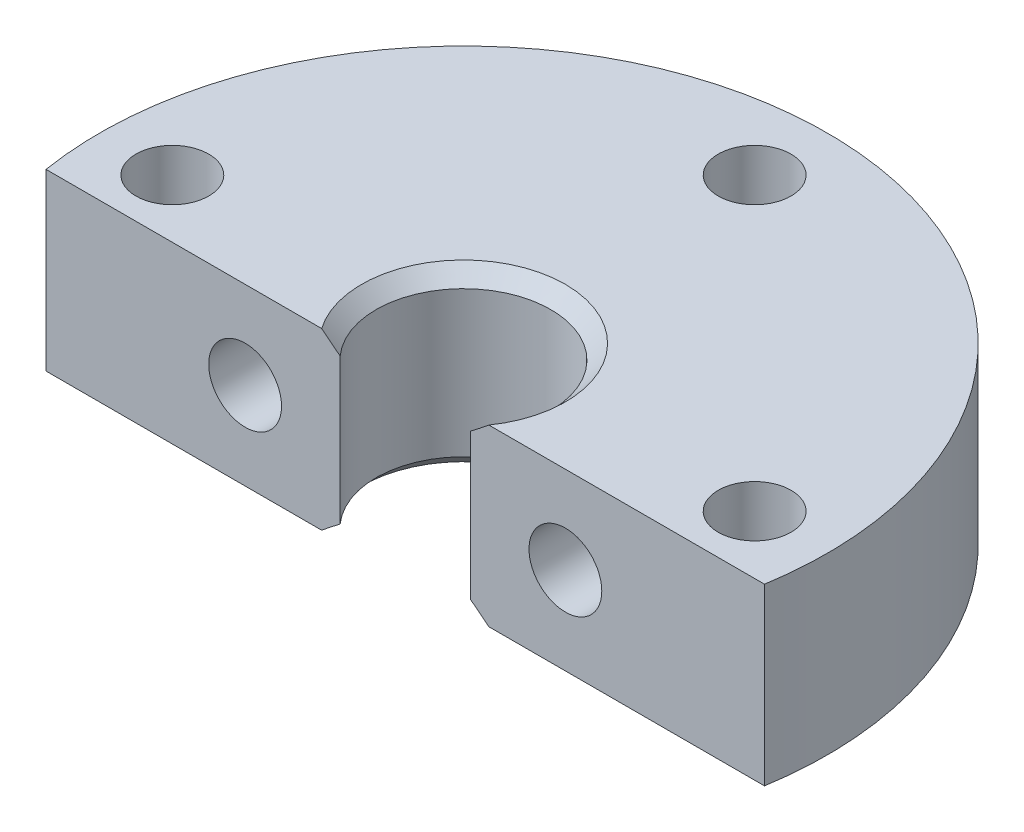
ISO-10303-21;
HEADER;
FILE_DESCRIPTION(('STEP AP214'),'2;1');
FILE_NAME('part.step','',(''),(''),'','','');
FILE_SCHEMA(('AUTOMOTIVE_DESIGN { 1 0 10303 214 1 1 1 1 }'));
ENDSEC;
DATA;
#1=APPLICATION_CONTEXT('core data for automotive mechanical design processes');
#2=APPLICATION_PROTOCOL_DEFINITION('international standard','automotive_design',2000,#1);
#3=PRODUCT_CONTEXT('',#1,'mechanical');
#4=PRODUCT('Part','Part','',(#3));
#5=PRODUCT_RELATED_PRODUCT_CATEGORY('part','',(#4));
#6=PRODUCT_DEFINITION_FORMATION('','',#4);
#7=PRODUCT_DEFINITION_CONTEXT('part definition',#1,'design');
#8=PRODUCT_DEFINITION('design','',#6,#7);
#9=PRODUCT_DEFINITION_SHAPE('','',#8);
#10=(LENGTH_UNIT() NAMED_UNIT(*) SI_UNIT(.MILLI.,.METRE.));
#11=(NAMED_UNIT(*) PLANE_ANGLE_UNIT() SI_UNIT($,.RADIAN.));
#12=(NAMED_UNIT(*) SI_UNIT($,.STERADIAN.) SOLID_ANGLE_UNIT());
#13=UNCERTAINTY_MEASURE_WITH_UNIT(LENGTH_MEASURE(1.E-05),#10,'distance_accuracy_value','');
#14=(GEOMETRIC_REPRESENTATION_CONTEXT(3) GLOBAL_UNCERTAINTY_ASSIGNED_CONTEXT((#13)) GLOBAL_UNIT_ASSIGNED_CONTEXT((#10,
#11,#12)) REPRESENTATION_CONTEXT('',''));
#15=CARTESIAN_POINT('',(0.,0.,0.));
#16=DIRECTION('',(0.,0.,1.));
#17=DIRECTION('',(1.,0.,0.));
#18=AXIS2_PLACEMENT_3D('',#15,#16,#17);
#19=CARTESIAN_POINT('',(-12.3389626792531,47.8260526926028,2.));
#20=DIRECTION('',(0.,0.,-1.));
#21=DIRECTION('',(-1.,0.,0.));
#22=AXIS2_PLACEMENT_3D('',#19,#20,#21);
#23=PLANE('',#22);
#24=CARTESIAN_POINT('',(5.5,0.,2.));
#25=DIRECTION('',(0.,0.,1.));
#26=DIRECTION('',(1.,0.,0.));
#27=AXIS2_PLACEMENT_3D('',#24,#25,#26);
#28=CIRCLE('',#27,1.25);
#29=CARTESIAN_POINT('',(6.75,0.,2.));
#30=VERTEX_POINT('',#29);
#31=EDGE_CURVE('E124',#30,#30,#28,.T.);
#32=ORIENTED_EDGE('',*,*,#31,.F.);
#33=EDGE_LOOP('',(#32));
#34=FACE_BOUND('',#33,.T.);
#35=DIRECTION('',(0.,-1.,0.));
#36=VECTOR('',#35,1.);
#37=CARTESIAN_POINT('',(2.23606797749979,3.,2.));
#38=LINE('',#37,#36);
#39=CARTESIAN_POINT('',(2.23606797749979,2.5,2.));
#40=VERTEX_POINT('',#39);
#41=CARTESIAN_POINT('',(2.23606797749979,-2.5,2.));
#42=VERTEX_POINT('',#41);
#43=EDGE_CURVE('E150',#40,#42,#38,.T.);
#44=ORIENTED_EDGE('',*,*,#43,.T.);
#45=CARTESIAN_POINT('',(2.23606797749979,-2.5,2.));
#46=CARTESIAN_POINT('',(2.29014100075972,-2.54030914708773,2.));
#47=CARTESIAN_POINT('',(2.34390647751658,-2.58102771859284,2.));
#48=CARTESIAN_POINT('',(2.45088416810582,-2.66317097450976,2.));
#49=CARTESIAN_POINT('',(2.50409645531304,-2.70459556330116,2.));
#50=CARTESIAN_POINT('',(2.61004249408468,-2.78804774999364,2.));
#51=CARTESIAN_POINT('',(2.66277626003621,-2.83007532966664,2.));
#52=CARTESIAN_POINT('',(2.76782848015724,-2.9146609758981,2.));
#53=CARTESIAN_POINT('',(2.82014687764002,-2.95721911289362,2.));
#54=CARTESIAN_POINT('',(2.87228132326901,-3.,2.));
#55=B_SPLINE_CURVE_WITH_KNOTS('',3,(#45,#46,#47,#48,#49,#50,#51,#52,#53,#54),.UNSPECIFIED.,.F.,
.F.,(4,2,2,2,4),(0.,0.202327942602672,0.404628697035497,0.606923348858633,0.809245149648635),.UNSPECIFIED.);
#56=CARTESIAN_POINT('',(2.87228132326901,-3.,2.));
#57=VERTEX_POINT('',#56);
#58=EDGE_CURVE('E49',#42,#57,#55,.T.);
#59=ORIENTED_EDGE('',*,*,#58,.T.);
#60=DIRECTION('',(-1.,0.,0.));
#61=VECTOR('',#60,1.);
#62=CARTESIAN_POINT('',(0.,-3.,2.));
#63=LINE('',#62,#61);
#64=CARTESIAN_POINT('',(12.3389626792531,-3.,2.));
#65=VERTEX_POINT('',#64);
#66=EDGE_CURVE('E102',#65,#57,#63,.T.);
#67=ORIENTED_EDGE('',*,*,#66,.F.);
#68=DIRECTION('',(0.,-1.,0.));
#69=VECTOR('',#68,1.);
#70=CARTESIAN_POINT('',(12.3389626792531,47.8260526926028,2.));
#71=LINE('',#70,#69);
#72=CARTESIAN_POINT('',(12.3389626792531,3.,2.));
#73=VERTEX_POINT('',#72);
#74=EDGE_CURVE('E109',#73,#65,#71,.T.);
#75=ORIENTED_EDGE('',*,*,#74,.F.);
#76=DIRECTION('',(-1.,0.,0.));
#77=VECTOR('',#76,1.);
#78=CARTESIAN_POINT('',(0.,3.,2.));
#79=LINE('',#78,#77);
#80=CARTESIAN_POINT('',(2.87228132326901,3.,2.));
#81=VERTEX_POINT('',#80);
#82=EDGE_CURVE('E93',#73,#81,#79,.T.);
#83=ORIENTED_EDGE('',*,*,#82,.T.);
#84=CARTESIAN_POINT('',(2.87228132326901,3.,2.));
#85=CARTESIAN_POINT('',(2.82014687764002,2.95721911289362,2.));
#86=CARTESIAN_POINT('',(2.76782848015724,2.9146609758981,2.));
#87=CARTESIAN_POINT('',(2.66277626003621,2.83007532966664,2.));
#88=CARTESIAN_POINT('',(2.61004249408468,2.78804774999364,2.));
#89=CARTESIAN_POINT('',(2.50409645531304,2.70459556330116,2.));
#90=CARTESIAN_POINT('',(2.45088416810582,2.66317097450976,2.));
#91=CARTESIAN_POINT('',(2.34390647751658,2.58102771859284,2.));
#92=CARTESIAN_POINT('',(2.29014100075972,2.54030914708773,2.));
#93=CARTESIAN_POINT('',(2.23606797749979,2.5,2.));
#94=B_SPLINE_CURVE_WITH_KNOTS('',3,(#84,#85,#86,#87,#88,#89,#90,#91,#92,#93),.UNSPECIFIED.,.F.,
.F.,(4,2,2,2,4),(0.,0.202321800790002,0.404616452613138,0.606917207045964,0.809245149648636),.UNSPECIFIED.);
#95=EDGE_CURVE('E199',#81,#40,#94,.T.);
#96=ORIENTED_EDGE('',*,*,#95,.T.);
#97=EDGE_LOOP('',(#44,#59,#67,#75,#83,#96));
#98=FACE_BOUND('',#97,.T.);
#99=ADVANCED_FACE('F40',(#34,#98),#23,.F.);
#100=CARTESIAN_POINT('',(0.,3.,0.));
#101=DIRECTION('',(0.,1.,0.));
#102=DIRECTION('',(0.,0.,1.));
#103=AXIS2_PLACEMENT_3D('',#100,#101,#102);
#104=PLANE('',#103);
#105=CARTESIAN_POINT('',(-2.87228132326901,3.,2.));
#106=VERTEX_POINT('',#105);
#107=CARTESIAN_POINT('',(-12.3389626792531,3.,2.));
#108=VERTEX_POINT('',#107);
#109=EDGE_CURVE('E104',#106,#108,#79,.T.);
#110=ORIENTED_EDGE('',*,*,#109,.F.);
#111=CARTESIAN_POINT('',(0.,3.,0.));
#112=DIRECTION('',(0.,1.,0.));
#113=DIRECTION('',(0.,0.,1.));
#114=AXIS2_PLACEMENT_3D('',#111,#112,#113);
#115=CIRCLE('',#114,3.5);
#116=EDGE_CURVE('E11',#106,#81,#115,.F.);
#117=ORIENTED_EDGE('',*,*,#116,.T.);
#118=ORIENTED_EDGE('',*,*,#82,.F.);
#119=CARTESIAN_POINT('',(0.,3.,0.));
#120=DIRECTION('',(0.,1.,0.));
#121=DIRECTION('',(0.,0.,1.));
#122=AXIS2_PLACEMENT_3D('',#119,#120,#121);
#123=CIRCLE('',#122,12.5);
#124=EDGE_CURVE('E97',#73,#108,#123,.T.);
#125=ORIENTED_EDGE('',*,*,#124,.T.);
#126=EDGE_LOOP('',(#110,#117,#118,#125));
#127=FACE_BOUND('',#126,.T.);
#128=CARTESIAN_POINT('',(0.,3.,-10.));
#129=DIRECTION('',(0.,1.,0.));
#130=DIRECTION('',(0.,0.,1.));
#131=AXIS2_PLACEMENT_3D('',#128,#129,#130);
#132=CIRCLE('',#131,1.25);
#133=CARTESIAN_POINT('',(0.,3.,-8.75));
#134=VERTEX_POINT('',#133);
#135=EDGE_CURVE('E101',#134,#134,#132,.T.);
#136=ORIENTED_EDGE('',*,*,#135,.F.);
#137=EDGE_LOOP('',(#136));
#138=FACE_BOUND('',#137,.T.);
#139=CARTESIAN_POINT('',(10.,3.,0.));
#140=DIRECTION('',(0.,1.,0.));
#141=DIRECTION('',(0.,0.,1.));
#142=AXIS2_PLACEMENT_3D('',#139,#140,#141);
#143=CIRCLE('',#142,1.25);
#144=CARTESIAN_POINT('',(10.,3.,1.25));
#145=VERTEX_POINT('',#144);
#146=EDGE_CURVE('E133',#145,#145,#143,.T.);
#147=ORIENTED_EDGE('',*,*,#146,.F.);
#148=EDGE_LOOP('',(#147));
#149=FACE_BOUND('',#148,.T.);
#150=CARTESIAN_POINT('',(-10.,3.,0.));
#151=DIRECTION('',(0.,1.,0.));
#152=DIRECTION('',(0.,0.,1.));
#153=AXIS2_PLACEMENT_3D('',#150,#151,#152);
#154=CIRCLE('',#153,1.25);
#155=CARTESIAN_POINT('',(-10.,3.,1.25));
#156=VERTEX_POINT('',#155);
#157=EDGE_CURVE('E139',#156,#156,#154,.T.);
#158=ORIENTED_EDGE('',*,*,#157,.F.);
#159=EDGE_LOOP('',(#158));
#160=FACE_BOUND('',#159,.T.);
#161=ADVANCED_FACE('F95',(#127,#138,#149,#160),#104,.T.);
#162=CARTESIAN_POINT('',(0.,-3.,0.));
#163=DIRECTION('',(0.,1.,0.));
#164=DIRECTION('',(0.,0.,1.));
#165=AXIS2_PLACEMENT_3D('',#162,#163,#164);
#166=PLANE('',#165);
#167=CARTESIAN_POINT('',(0.,-3.,-10.));
#168=DIRECTION('',(0.,1.,0.));
#169=DIRECTION('',(0.,0.,1.));
#170=AXIS2_PLACEMENT_3D('',#167,#168,#169);
#171=CIRCLE('',#170,1.25);
#172=CARTESIAN_POINT('',(0.,-3.,-8.75));
#173=VERTEX_POINT('',#172);
#174=EDGE_CURVE('E130',#173,#173,#171,.T.);
#175=ORIENTED_EDGE('',*,*,#174,.T.);
#176=EDGE_LOOP('',(#175));
#177=FACE_BOUND('',#176,.T.);
#178=CARTESIAN_POINT('',(10.,-3.,0.));
#179=DIRECTION('',(0.,1.,0.));
#180=DIRECTION('',(0.,0.,1.));
#181=AXIS2_PLACEMENT_3D('',#178,#179,#180);
#182=CIRCLE('',#181,1.25);
#183=CARTESIAN_POINT('',(10.,-3.,1.25));
#184=VERTEX_POINT('',#183);
#185=EDGE_CURVE('E136',#184,#184,#182,.T.);
#186=ORIENTED_EDGE('',*,*,#185,.T.);
#187=EDGE_LOOP('',(#186));
#188=FACE_BOUND('',#187,.T.);
#189=CARTESIAN_POINT('',(-10.,-3.,0.));
#190=DIRECTION('',(0.,1.,0.));
#191=DIRECTION('',(0.,0.,1.));
#192=AXIS2_PLACEMENT_3D('',#189,#190,#191);
#193=CIRCLE('',#192,1.25);
#194=CARTESIAN_POINT('',(-10.,-3.,1.25));
#195=VERTEX_POINT('',#194);
#196=EDGE_CURVE('E142',#195,#195,#193,.T.);
#197=ORIENTED_EDGE('',*,*,#196,.T.);
#198=EDGE_LOOP('',(#197));
#199=FACE_BOUND('',#198,.T.);
#200=ORIENTED_EDGE('',*,*,#66,.T.);
#201=CARTESIAN_POINT('',(0.,-3.,0.));
#202=DIRECTION('',(0.,1.,0.));
#203=DIRECTION('',(0.,0.,1.));
#204=AXIS2_PLACEMENT_3D('',#201,#202,#203);
#205=CIRCLE('',#204,3.5);
#206=CARTESIAN_POINT('',(-2.87228132326901,-3.,2.));
#207=VERTEX_POINT('',#206);
#208=EDGE_CURVE('E152',#57,#207,#205,.T.);
#209=ORIENTED_EDGE('',*,*,#208,.T.);
#210=CARTESIAN_POINT('',(-12.3389626792531,-3.,2.));
#211=VERTEX_POINT('',#210);
#212=EDGE_CURVE('E118',#207,#211,#63,.T.);
#213=ORIENTED_EDGE('',*,*,#212,.T.);
#214=CARTESIAN_POINT('',(0.,-3.,0.));
#215=DIRECTION('',(0.,1.,0.));
#216=DIRECTION('',(0.,0.,1.));
#217=AXIS2_PLACEMENT_3D('',#214,#215,#216);
#218=CIRCLE('',#217,12.5);
#219=EDGE_CURVE('E114',#65,#211,#218,.T.);
#220=ORIENTED_EDGE('',*,*,#219,.F.);
#221=EDGE_LOOP('',(#200,#209,#213,#220));
#222=FACE_BOUND('',#221,.T.);
#223=ADVANCED_FACE('F226',(#177,#188,#199,#222),#166,.F.);
#224=CARTESIAN_POINT('',(0.,3.,0.));
#225=DIRECTION('',(0.,-1.,0.));
#226=DIRECTION('',(0.,0.,-1.));
#227=AXIS2_PLACEMENT_3D('',#224,#225,#226);
#228=CYLINDRICAL_SURFACE('',#227,12.5);
#229=CARTESIAN_POINT('',(-4.25,0.,-11.7553179455087));
#230=CARTESIAN_POINT('',(-4.25000345674519,0.0668613484608272,-11.7553172332848));
#231=CARTESIAN_POINT('',(-4.25538818627799,0.133776691509218,-11.7533742342802));
#232=CARTESIAN_POINT('',(-4.27673836774484,0.26572384369361,-11.7456218404402));
#233=CARTESIAN_POINT('',(-4.29271765494207,0.330753073731363,-11.7398073898961));
#234=CARTESIAN_POINT('',(-4.33461832346783,0.456943222824921,-11.7244009693629));
#235=CARTESIAN_POINT('',(-4.3605251592069,0.518109649551407,-11.7148145254535));
#236=CARTESIAN_POINT('',(-4.42130977785059,0.63503550734847,-11.692008734906));
#237=CARTESIAN_POINT('',(-4.45618564412297,0.690796090116854,-11.6787901643919));
#238=CARTESIAN_POINT('',(-4.53445042013958,0.796637347034647,-11.6486285442597));
#239=CARTESIAN_POINT('',(-4.5779942689212,0.846583639425174,-11.6316169081463));
#240=CARTESIAN_POINT('',(-4.67165471340862,0.938429334319294,-11.5943167374045));
#241=CARTESIAN_POINT('',(-4.72177280392449,0.980326901398347,-11.5740274572823));
#242=CARTESIAN_POINT('',(-4.82996797685817,1.0574557490607,-11.5293112055411));
#243=CARTESIAN_POINT('',(-4.8883330047006,1.09218515538404,-11.5047166165608));
#244=CARTESIAN_POINT('',(-5.00887144465323,1.15143735665078,-11.4527515384886));
#245=CARTESIAN_POINT('',(-5.07104607487446,1.17595686726184,-11.4253801596714));
#246=CARTESIAN_POINT('',(-5.2025011216038,1.21617461271224,-11.3661589798297));
#247=CARTESIAN_POINT('',(-5.27195652117598,1.23103078625171,-11.3341263138329));
#248=CARTESIAN_POINT('',(-5.41148949146377,1.24884694809605,-11.2681740403745));
#249=CARTESIAN_POINT('',(-5.48156729192876,1.25180234351852,-11.234253709523));
#250=CARTESIAN_POINT('',(-5.62645436866693,1.24586942784723,-11.1624401249244));
#251=CARTESIAN_POINT('',(-5.70117565521891,1.23598142875191,-11.124450301522));
#252=CARTESIAN_POINT('',(-5.84754885476173,1.20305555664296,-11.0482121953589));
#253=CARTESIAN_POINT('',(-5.91919946654668,1.18001216709149,-11.0099638108272));
#254=CARTESIAN_POINT('',(-6.06095084580953,1.11983959010204,-10.9325978464201));
#255=CARTESIAN_POINT('',(-6.13081592153604,1.08209273203985,-10.8935254141596));
#256=CARTESIAN_POINT('',(-6.26313564257604,0.993214242157514,-10.817991452027));
#257=CARTESIAN_POINT('',(-6.3255889532468,0.94208020499559,-10.7815303928542));
#258=CARTESIAN_POINT('',(-6.43835838749237,0.829501172039707,-10.7145542519981));
#259=CARTESIAN_POINT('',(-6.48906318598494,0.768556740657068,-10.6838583504358));
#260=CARTESIAN_POINT('',(-6.57894417327889,0.636201467528272,-10.6287478634939));
#261=CARTESIAN_POINT('',(-6.61813649572527,0.564805485067386,-10.6043244938501));
#262=CARTESIAN_POINT('',(-6.67788325146892,0.424348376796737,-10.5667851637489));
#263=CARTESIAN_POINT('',(-6.70028406723274,0.356371897579531,-10.5525618049955));
#264=CARTESIAN_POINT('',(-6.73319100802673,0.216514747344688,-10.5315968779079));
#265=CARTESIAN_POINT('',(-6.74371304062787,0.144639433078595,-10.5248453039109));
#266=CARTESIAN_POINT('',(-6.75148794351955,0.0105447371655662,-10.519858393158));
#267=CARTESIAN_POINT('',(-6.75046408213084,-0.051540831638064,-10.520517018036));
#268=CARTESIAN_POINT('',(-6.73929301123134,-0.174533530603388,-10.5276765765414));
#269=CARTESIAN_POINT('',(-6.72914729130722,-0.23544085151251,-10.5341765562837));
#270=CARTESIAN_POINT('',(-6.70080929528355,-0.352194547865052,-10.5522234900481));
#271=CARTESIAN_POINT('',(-6.682915891399,-0.408143864675181,-10.5635828126127));
#272=CARTESIAN_POINT('',(-6.63996846894322,-0.516090007051906,-10.5906307705649));
#273=CARTESIAN_POINT('',(-6.61491279209622,-0.568085913754807,-10.6063204085182));
#274=CARTESIAN_POINT('',(-6.5561399045948,-0.671492267431835,-10.6427590574689));
#275=CARTESIAN_POINT('',(-6.52186508134485,-0.722472089378917,-10.6638260662586));
#276=CARTESIAN_POINT('',(-6.44710886278282,-0.818028352743835,-10.7091876388131));
#277=CARTESIAN_POINT('',(-6.40662433668151,-0.862601542003174,-10.7334838298277));
#278=CARTESIAN_POINT('',(-6.31428945362473,-0.950828636926263,-10.7880960900921));
#279=CARTESIAN_POINT('',(-6.26164194906051,-0.993423834649065,-10.8187750690453));
#280=CARTESIAN_POINT('',(-6.15100455994088,-1.06920309393133,-10.8820591695239));
#281=CARTESIAN_POINT('',(-6.09301168989054,-1.1023818535056,-10.9146653637464));
#282=CARTESIAN_POINT('',(-5.96516624916379,-1.16264185292153,-10.9851159205881));
#283=CARTESIAN_POINT('',(-5.89474989167102,-1.18837942710726,-11.0230923306814));
#284=CARTESIAN_POINT('',(-5.75044744567118,-1.22693015939865,-11.0990544679328));
#285=CARTESIAN_POINT('',(-5.67655995715346,-1.23973805492108,-11.1370401925953));
#286=CARTESIAN_POINT('',(-5.52319022924411,-1.25227218607796,-11.2139243038092));
#287=CARTESIAN_POINT('',(-5.44361811781652,-1.25127500325224,-11.2527656231855));
#288=CARTESIAN_POINT('',(-5.28501414662015,-1.2339532667149,-11.3281212003068));
#289=CARTESIAN_POINT('',(-5.20598222038514,-1.21763063418609,-11.3646357491206));
#290=CARTESIAN_POINT('',(-5.05408897020462,-1.17036321388702,-11.4329726521292));
#291=CARTESIAN_POINT('',(-4.98110740177532,-1.13998878634082,-11.4649195009553));
#292=CARTESIAN_POINT('',(-4.84096127845225,-1.06511389142923,-11.5247948698215));
#293=CARTESIAN_POINT('',(-4.77379316144207,-1.02062215337791,-11.552725857566));
#294=CARTESIAN_POINT('',(-4.65365360677432,-0.922860358787281,-11.6016102066832));
#295=CARTESIAN_POINT('',(-4.59995740609171,-0.870678202681455,-11.6229575808767));
#296=CARTESIAN_POINT('',(-4.5021359084911,-0.756574149688452,-11.6611979179524));
#297=CARTESIAN_POINT('',(-4.45800815618737,-0.694654758552783,-11.6780920238406));
#298=CARTESIAN_POINT('',(-4.38450050860092,-0.568384593618249,-11.7058779211666));
#299=CARTESIAN_POINT('',(-4.35421118447654,-0.504644233923224,-11.7171469383675));
#300=CARTESIAN_POINT('',(-4.30471574667119,-0.372497111755937,-11.7354218857582));
#301=CARTESIAN_POINT('',(-4.28549011270039,-0.304098807573135,-11.7424353254996));
#302=CARTESIAN_POINT('',(-4.26482190134429,-0.195917784570939,-11.7499510057766));
#303=CARTESIAN_POINT('',(-4.25927241700521,-0.156975478670739,-11.7519621356184));
#304=CARTESIAN_POINT('',(-4.25186048738663,-0.0786950125277672,-11.7546458011511));
#305=CARTESIAN_POINT('',(-4.24999796524238,-0.0393568605546693,-11.7553183647479));
#306=CARTESIAN_POINT('',(-4.25,0.,-11.7553179455087));
#307=B_SPLINE_CURVE_WITH_KNOTS('',3,(#229,#230,#231,#232,#233,#234,#235,#236,#237,#238,#239,
#240,#241,#242,#243,#244,#245,#246,#247,#248,#249,#250,#251,#252,#253,#254,#255,#256,#257,#258,
#259,#260,#261,#262,#263,#264,#265,#266,#267,#268,#269,#270,#271,#272,#273,#274,#275,#276,#277,
#278,#279,#280,#281,#282,#283,#284,#285,#286,#287,#288,#289,#290,#291,#292,#293,#294,#295,#296,
#297,#298,#299,#300,#301,#302,#303,#304,#305,#306),.UNSPECIFIED.,.T.,.F.,(4,2,2,2,2,2,2,2,2,2,2,
2,2,2,2,2,2,2,2,2,2,2,2,2,2,2,2,2,2,2,2,2,2,2,2,2,2,2,4),(0.,0.200435989372092,0.40113424179102,
0.601539553713002,0.801902075661829,1.00623327892485,1.2106110225353,1.42638297912781,
1.64222429199842,1.87498351871439,2.10783256588961,2.35993824184654,2.61214971269543,
2.87635367138669,3.14060513354949,3.39417090739185,3.64737961868948,3.86496512912095,
4.08225891118552,4.26760896841413,4.4529287637354,4.63166054692787,4.81043374532221,
5.00450082445675,5.19866607132667,5.42082019613846,5.64309915919669,5.89412723574543,
6.14525744353823,6.40959512966,6.67389968310146,6.92830823329511,7.18255977777084,
7.41488531548009,7.64715116475751,7.86046932187923,8.07340994666121,8.1913958372916,
8.30937926815938),.UNSPECIFIED.);
#308=CARTESIAN_POINT('',(-4.25,0.,-11.7553179455087));
#309=VERTEX_POINT('',#308);
#310=EDGE_CURVE('E160',#309,#309,#307,.T.);
#311=ORIENTED_EDGE('',*,*,#310,.T.);
#312=EDGE_LOOP('',(#311));
#313=FACE_BOUND('',#312,.T.);
#314=CARTESIAN_POINT('',(6.75,0.,-10.5208127062504));
#315=CARTESIAN_POINT('',(6.7499968001028,0.0626191669154326,-10.520815204356));
#316=CARTESIAN_POINT('',(6.74526699382063,0.125268368654247,-10.5238539532273));
#317=CARTESIAN_POINT('',(6.72661536496011,0.248626826666854,-10.5357848304883));
#318=CARTESIAN_POINT('',(6.71268586771002,0.309334418818792,-10.5446818460097));
#319=CARTESIAN_POINT('',(6.6764603656625,0.426858711286303,-10.5676549073736));
#320=CARTESIAN_POINT('',(6.65419807430464,0.483690013702837,-10.5817100795472));
#321=CARTESIAN_POINT('',(6.60230333438331,0.592507641911917,-10.6141661797684));
#322=CARTESIAN_POINT('',(6.57266964999439,0.644493153289024,-10.6325678364849));
#323=CARTESIAN_POINT('',(6.50484786967596,0.746167579025732,-10.6742043685657));
#324=CARTESIAN_POINT('',(6.46621381461773,0.795457273612462,-10.6976834753877));
#325=CARTESIAN_POINT('',(6.38295663143775,0.886972120240242,-10.7475681866877));
#326=CARTESIAN_POINT('',(6.33833090558829,0.929194190127341,-10.7739750596476));
#327=CARTESIAN_POINT('',(6.23710641180984,1.01196007461214,-10.8329321802554));
#328=CARTESIAN_POINT('',(6.17971565084942,1.05130332878901,-10.8658099249478));
#329=CARTESIAN_POINT('',(6.05990996577121,1.11971678550472,-10.9330791470633));
#330=CARTESIAN_POINT('',(5.99749210145299,1.14878092173835,-10.9674715049303));
#331=CARTESIAN_POINT('',(5.86161762826284,1.19898211234737,-11.0407447647739));
#332=CARTESIAN_POINT('',(5.78771541492501,1.21883039721264,-11.0796886939314));
#333=CARTESIAN_POINT('',(5.63722515586259,1.24479001037631,-11.1570091939385));
#334=CARTESIAN_POINT('',(5.56063632996763,1.2508973143009,-11.1953855953058));
#335=CARTESIAN_POINT('',(5.40458299121282,1.24886167849445,-11.2715672650098));
#336=CARTESIAN_POINT('',(5.32509915411938,1.24030355432007,-11.3093243086821));
#337=CARTESIAN_POINT('',(5.16797823873401,1.2077629224144,-11.3819807844669));
#338=CARTESIAN_POINT('',(5.09034066289362,1.18378462024997,-11.4168809928035));
#339=CARTESIAN_POINT('',(4.94395456679387,1.1221716542803,-11.4809996601218));
#340=CARTESIAN_POINT('',(4.8749520347649,1.08535913205567,-11.5104248730619));
#341=CARTESIAN_POINT('',(4.74393142005977,0.998511569761708,-11.5650400429411));
#342=CARTESIAN_POINT('',(4.681909109841,0.948484595098716,-11.5902325679974));
#343=CARTESIAN_POINT('',(4.57277115590305,0.841462136406786,-11.6336973411895));
#344=CARTESIAN_POINT('',(4.52481865649466,0.785489072076126,-11.6523868538145));
#345=CARTESIAN_POINT('',(4.43905775347717,0.66509726948904,-11.6853276811793));
#346=CARTESIAN_POINT('',(4.40124426990987,0.600682784819063,-11.6995812190559));
#347=CARTESIAN_POINT('',(4.33989341344855,0.470565247014682,-11.7224707343232));
#348=CARTESIAN_POINT('',(4.31549196088883,0.405328952720885,-11.7314503087478));
#349=CARTESIAN_POINT('',(4.27781494676186,0.27130119871156,-11.7452418859145));
#350=CARTESIAN_POINT('',(4.26453611127883,0.202510791474671,-11.7500551150243));
#351=CARTESIAN_POINT('',(4.24998045090966,0.0665262623669337,-11.7553274154351));
#352=CARTESIAN_POINT('',(4.24821041990868,-0.000608639409579366,-11.7559654225758));
#353=CARTESIAN_POINT('',(4.2554277839696,-0.134216370153728,-11.7533547996119));
#354=CARTESIAN_POINT('',(4.2644139516124,-0.200689273791046,-11.7501066129715));
#355=CARTESIAN_POINT('',(4.29263324922586,-0.330330638496287,-11.7398261948057));
#356=CARTESIAN_POINT('',(4.31175130168296,-0.393527628814085,-11.7328364509366));
#357=CARTESIAN_POINT('',(4.3594463443881,-0.515691594687616,-11.7151982511693));
#358=CARTESIAN_POINT('',(4.38802363988157,-0.574658433663585,-11.7045496772019));
#359=CARTESIAN_POINT('',(4.45420097811662,-0.687881369815717,-11.6795274696106));
#360=CARTESIAN_POINT('',(4.49195338745919,-0.742034237609723,-11.6650905626921));
#361=CARTESIAN_POINT('',(4.57487415779576,-0.843161100850198,-11.6328200360742));
#362=CARTESIAN_POINT('',(4.62004372197025,-0.890133929189103,-11.6149858652094));
#363=CARTESIAN_POINT('',(4.71856578042927,-0.977964148668402,-11.5753219745623));
#364=CARTESIAN_POINT('',(4.77219983033623,-1.01843896498002,-11.5533457755852));
#365=CARTESIAN_POINT('',(4.88427588207588,-1.08986426062365,-11.5064130439992));
#366=CARTESIAN_POINT('',(4.94271924070765,-1.12081204043905,-11.48145566944));
#367=CARTESIAN_POINT('',(5.06707765920846,-1.1747314048392,-11.4271450525008));
#368=CARTESIAN_POINT('',(5.13322793269748,-1.19697122874542,-11.3976048790533));
#369=CARTESIAN_POINT('',(5.26729590744731,-1.23009043873566,-11.336270810233));
#370=CARTESIAN_POINT('',(5.33521426168549,-1.24096556487703,-11.3044760745255));
#371=CARTESIAN_POINT('',(5.47691223664934,-1.25197176888655,-11.236552292166));
#372=CARTESIAN_POINT('',(5.5507020463319,-1.25111702340364,-11.2002840434045));
#373=CARTESIAN_POINT('',(5.69654848265614,-1.23662636766816,-11.1268150862597));
#374=CARTESIAN_POINT('',(5.76860444031406,-1.22298560270392,-11.089614028921));
#375=CARTESIAN_POINT('',(5.9138980726085,-1.18205349634425,-11.0128555442252));
#376=CARTESIAN_POINT('',(5.98690508925535,-1.15392811469178,-10.9733030482632));
#377=CARTESIAN_POINT('',(6.12708409433064,-1.08415769709351,-10.8956536270878));
#378=CARTESIAN_POINT('',(6.19425291334694,-1.0425053751041,-10.8575574987088));
#379=CARTESIAN_POINT('',(6.32031860853144,-0.946482612382575,-10.784658185375));
#380=CARTESIAN_POINT('',(6.37925189154594,-0.892171175128503,-10.7498407446564));
#381=CARTESIAN_POINT('',(6.4867492179722,-0.771571573525367,-10.6853176509304));
#382=CARTESIAN_POINT('',(6.53532983831292,-0.705302874525516,-10.6556038408995));
#383=CARTESIAN_POINT('',(6.6085730422657,-0.580827337893174,-10.6102836760174));
#384=CARTESIAN_POINT('',(6.63617320482647,-0.524941351976154,-10.5930149892551));
#385=CARTESIAN_POINT('',(6.68300378353107,-0.408556450760421,-10.5635330366104));
#386=CARTESIAN_POINT('',(6.70224810865321,-0.348065399828862,-10.5513113712182));
#387=CARTESIAN_POINT('',(6.72776302586508,-0.239553337580955,-10.5350543860717));
#388=CARTESIAN_POINT('',(6.73607397723932,-0.192193897911722,-10.5297365220397));
#389=CARTESIAN_POINT('',(6.74719399929748,-0.0965623256688412,-10.5226145265643));
#390=CARTESIAN_POINT('',(6.75000246766834,-0.0482900937629345,-10.5208107797835));
#391=CARTESIAN_POINT('',(6.75,0.,-10.5208127062504));
#392=B_SPLINE_CURVE_WITH_KNOTS('',3,(#314,#315,#316,#317,#318,#319,#320,#321,#322,#323,#324,
#325,#326,#327,#328,#329,#330,#331,#332,#333,#334,#335,#336,#337,#338,#339,#340,#341,#342,#343,
#344,#345,#346,#347,#348,#349,#350,#351,#352,#353,#354,#355,#356,#357,#358,#359,#360,#361,#362,
#363,#364,#365,#366,#367,#368,#369,#370,#371,#372,#373,#374,#375,#376,#377,#378,#379,#380,#381,
#382,#383,#384,#385,#386,#387,#388,#389,#390,#391),.UNSPECIFIED.,.T.,.F.,(4,2,2,2,2,2,2,2,2,2,2,
2,2,2,2,2,2,2,2,2,2,2,2,2,2,2,2,2,2,2,2,2,2,2,2,2,2,2,4),(0.,0.187665644048491,
0.375488042770244,0.562558608291585,0.749660557645252,0.949538693120119,1.14950376858431,
1.37944722986185,1.60952616858822,1.86595041658418,2.1224497547631,2.38633121103219,
2.65014072904413,2.89946489413336,3.14863723509005,3.37553981104399,3.60232848850483,
3.811947462819,4.02150471458463,4.22201873085123,4.42250986809921,4.62077115789498,
4.81903884611528,5.02085591944774,5.22270576311891,5.4338768402987,5.64510769852699,
5.87149688102572,6.09797089282688,6.34358736123602,6.58929712532273,6.8510687771749,
7.11298166213558,7.37369736985373,7.6339924233629,7.82723402609945,8.02015271748711,
8.16485920544571,8.3095815323879),.UNSPECIFIED.);
#393=CARTESIAN_POINT('',(6.75,0.,-10.5208127062504));
#394=VERTEX_POINT('',#393);
#395=EDGE_CURVE('E121',#394,#394,#392,.T.);
#396=ORIENTED_EDGE('',*,*,#395,.T.);
#397=EDGE_LOOP('',(#396));
#398=FACE_BOUND('',#397,.T.);
#399=ORIENTED_EDGE('',*,*,#124,.F.);
#400=ORIENTED_EDGE('',*,*,#74,.T.);
#401=ORIENTED_EDGE('',*,*,#219,.T.);
#402=DIRECTION('',(0.,-1.,0.));
#403=VECTOR('',#402,1.);
#404=CARTESIAN_POINT('',(-12.3389626792531,47.8260526926028,2.));
#405=LINE('',#404,#403);
#406=EDGE_CURVE('E112',#108,#211,#405,.T.);
#407=ORIENTED_EDGE('',*,*,#406,.F.);
#408=EDGE_LOOP('',(#399,#400,#401,#407));
#409=FACE_BOUND('',#408,.T.);
#410=ADVANCED_FACE('F107',(#313,#398,#409),#228,.T.);
#411=CARTESIAN_POINT('',(0.,3.,0.));
#412=DIRECTION('',(0.,-1.,0.));
#413=DIRECTION('',(0.,0.,-1.));
#414=AXIS2_PLACEMENT_3D('',#411,#412,#413);
#415=CYLINDRICAL_SURFACE('',#414,3.);
#416=DIRECTION('',(0.,-1.,0.));
#417=VECTOR('',#416,1.);
#418=CARTESIAN_POINT('',(-2.23606797749979,3.,2.));
#419=LINE('',#418,#417);
#420=CARTESIAN_POINT('',(-2.23606797749979,-2.5,2.));
#421=VERTEX_POINT('',#420);
#422=CARTESIAN_POINT('',(-2.23606797749979,2.5,2.));
#423=VERTEX_POINT('',#422);
#424=EDGE_CURVE('E113',#421,#423,#419,.F.);
#425=ORIENTED_EDGE('',*,*,#424,.F.);
#426=CARTESIAN_POINT('',(0.,-2.5,0.));
#427=DIRECTION('',(0.,1.,0.));
#428=DIRECTION('',(0.,0.,1.));
#429=AXIS2_PLACEMENT_3D('',#426,#427,#428);
#430=CIRCLE('',#429,3.);
#431=EDGE_CURVE('E62',#421,#42,#430,.F.);
#432=ORIENTED_EDGE('',*,*,#431,.T.);
#433=ORIENTED_EDGE('',*,*,#43,.F.);
#434=CARTESIAN_POINT('',(0.,2.5,0.));
#435=DIRECTION('',(0.,1.,0.));
#436=DIRECTION('',(0.,0.,1.));
#437=AXIS2_PLACEMENT_3D('',#434,#435,#436);
#438=CIRCLE('',#437,3.);
#439=EDGE_CURVE('E242',#40,#423,#438,.T.);
#440=ORIENTED_EDGE('',*,*,#439,.T.);
#441=EDGE_LOOP('',(#425,#432,#433,#440));
#442=FACE_BOUND('',#441,.T.);
#443=ADVANCED_FACE('F245',(#442),#415,.F.);
#444=CARTESIAN_POINT('',(-10.,3.,0.));
#445=DIRECTION('',(0.,1.,0.));
#446=DIRECTION('',(0.,0.,1.));
#447=AXIS2_PLACEMENT_3D('',#444,#445,#446);
#448=CYLINDRICAL_SURFACE('',#447,1.25);
#449=ORIENTED_EDGE('',*,*,#196,.F.);
#450=EDGE_LOOP('',(#449));
#451=FACE_BOUND('',#450,.T.);
#452=ORIENTED_EDGE('',*,*,#157,.T.);
#453=EDGE_LOOP('',(#452));
#454=FACE_BOUND('',#453,.T.);
#455=ADVANCED_FACE('F247',(#451,#454),#448,.F.);
#456=CARTESIAN_POINT('',(10.,3.,0.));
#457=DIRECTION('',(0.,1.,0.));
#458=DIRECTION('',(0.,0.,1.));
#459=AXIS2_PLACEMENT_3D('',#456,#457,#458);
#460=CYLINDRICAL_SURFACE('',#459,1.25);
#461=ORIENTED_EDGE('',*,*,#185,.F.);
#462=EDGE_LOOP('',(#461));
#463=FACE_BOUND('',#462,.T.);
#464=ORIENTED_EDGE('',*,*,#146,.T.);
#465=EDGE_LOOP('',(#464));
#466=FACE_BOUND('',#465,.T.);
#467=ADVANCED_FACE('F253',(#463,#466),#460,.F.);
#468=CARTESIAN_POINT('',(0.,3.,-10.));
#469=DIRECTION('',(0.,1.,0.));
#470=DIRECTION('',(0.,0.,1.));
#471=AXIS2_PLACEMENT_3D('',#468,#469,#470);
#472=CYLINDRICAL_SURFACE('',#471,1.25);
#473=ORIENTED_EDGE('',*,*,#174,.F.);
#474=EDGE_LOOP('',(#473));
#475=FACE_BOUND('',#474,.T.);
#476=ORIENTED_EDGE('',*,*,#135,.T.);
#477=EDGE_LOOP('',(#476));
#478=FACE_BOUND('',#477,.T.);
#479=ADVANCED_FACE('F179',(#475,#478),#472,.F.);
#480=CARTESIAN_POINT('',(-5.5,0.,2.));
#481=DIRECTION('',(0.,0.,1.));
#482=DIRECTION('',(1.,0.,0.));
#483=AXIS2_PLACEMENT_3D('',#480,#481,#482);
#484=CIRCLE('',#483,1.25);
#485=CARTESIAN_POINT('',(-4.25,0.,2.));
#486=VERTEX_POINT('',#485);
#487=EDGE_CURVE('E231',#486,#486,#484,.T.);
#488=ORIENTED_EDGE('',*,*,#487,.F.);
#489=EDGE_LOOP('',(#488));
#490=FACE_BOUND('',#489,.T.);
#491=ORIENTED_EDGE('',*,*,#212,.F.);
#492=CARTESIAN_POINT('',(-2.87228132326901,-3.,2.));
#493=CARTESIAN_POINT('',(-2.82014687764002,-2.95721911289362,2.));
#494=CARTESIAN_POINT('',(-2.76782848015724,-2.9146609758981,2.));
#495=CARTESIAN_POINT('',(-2.66277626003621,-2.83007532966664,2.));
#496=CARTESIAN_POINT('',(-2.61004249408468,-2.78804774999364,2.));
#497=CARTESIAN_POINT('',(-2.50409645531304,-2.70459556330116,2.));
#498=CARTESIAN_POINT('',(-2.45088416810582,-2.66317097450976,2.));
#499=CARTESIAN_POINT('',(-2.34390647751658,-2.58102771859284,2.));
#500=CARTESIAN_POINT('',(-2.29014100075972,-2.54030914708773,2.));
#501=CARTESIAN_POINT('',(-2.23606797749979,-2.5,2.));
#502=B_SPLINE_CURVE_WITH_KNOTS('',3,(#492,#493,#494,#495,#496,#497,#498,#499,#500,#501),
.UNSPECIFIED.,.F.,.F.,(4,2,2,2,4),(0.,0.202321800790002,0.404616452613138,0.606917207045964,
0.809245149648635),.UNSPECIFIED.);
#503=EDGE_CURVE('E192',#207,#421,#502,.T.);
#504=ORIENTED_EDGE('',*,*,#503,.T.);
#505=ORIENTED_EDGE('',*,*,#424,.T.);
#506=CARTESIAN_POINT('',(-2.23606797749979,2.5,2.));
#507=CARTESIAN_POINT('',(-2.29014100075972,2.54030914708773,2.));
#508=CARTESIAN_POINT('',(-2.34390647751658,2.58102771859284,2.));
#509=CARTESIAN_POINT('',(-2.45088416810582,2.66317097450976,2.));
#510=CARTESIAN_POINT('',(-2.50409645531304,2.70459556330116,2.));
#511=CARTESIAN_POINT('',(-2.61004249408468,2.78804774999364,2.));
#512=CARTESIAN_POINT('',(-2.66277626003621,2.83007532966664,2.));
#513=CARTESIAN_POINT('',(-2.76782848015724,2.9146609758981,2.));
#514=CARTESIAN_POINT('',(-2.82014687764002,2.95721911289362,2.));
#515=CARTESIAN_POINT('',(-2.87228132326901,3.,2.));
#516=B_SPLINE_CURVE_WITH_KNOTS('',3,(#506,#507,#508,#509,#510,#511,#512,#513,#514,#515),
.UNSPECIFIED.,.F.,.F.,(4,2,2,2,4),(0.,0.202327942602672,0.404628697035497,0.606923348858633,
0.809245149648636),.UNSPECIFIED.);
#517=EDGE_CURVE('E185',#423,#106,#516,.T.);
#518=ORIENTED_EDGE('',*,*,#517,.T.);
#519=ORIENTED_EDGE('',*,*,#109,.T.);
#520=ORIENTED_EDGE('',*,*,#406,.T.);
#521=EDGE_LOOP('',(#491,#504,#505,#518,#519,#520));
#522=FACE_BOUND('',#521,.T.);
#523=ADVANCED_FACE('F173',(#490,#522),#23,.F.);
#524=CARTESIAN_POINT('',(5.5,0.,2.));
#525=DIRECTION('',(0.,0.,1.));
#526=DIRECTION('',(1.,0.,0.));
#527=AXIS2_PLACEMENT_3D('',#524,#525,#526);
#528=CYLINDRICAL_SURFACE('',#527,1.25);
#529=ORIENTED_EDGE('',*,*,#31,.T.);
#530=EDGE_LOOP('',(#529));
#531=FACE_BOUND('',#530,.T.);
#532=ORIENTED_EDGE('',*,*,#395,.F.);
#533=EDGE_LOOP('',(#532));
#534=FACE_BOUND('',#533,.T.);
#535=ADVANCED_FACE('F168',(#531,#534),#528,.F.);
#536=CARTESIAN_POINT('',(-5.5,0.,2.));
#537=DIRECTION('',(0.,0.,1.));
#538=DIRECTION('',(1.,0.,0.));
#539=AXIS2_PLACEMENT_3D('',#536,#537,#538);
#540=CYLINDRICAL_SURFACE('',#539,1.25);
#541=ORIENTED_EDGE('',*,*,#487,.T.);
#542=EDGE_LOOP('',(#541));
#543=FACE_BOUND('',#542,.T.);
#544=ORIENTED_EDGE('',*,*,#310,.F.);
#545=EDGE_LOOP('',(#544));
#546=FACE_BOUND('',#545,.T.);
#547=ADVANCED_FACE('F172',(#543,#546),#540,.F.);
#548=CARTESIAN_POINT('',(0.,-3.,0.));
#549=DIRECTION('',(0.,-1.,0.));
#550=DIRECTION('',(0.,0.,-1.));
#551=AXIS2_PLACEMENT_3D('',#548,#549,#550);
#552=CONICAL_SURFACE('',#551,3.5,0.785398163397449);
#553=ORIENTED_EDGE('',*,*,#58,.F.);
#554=ORIENTED_EDGE('',*,*,#431,.F.);
#555=ORIENTED_EDGE('',*,*,#503,.F.);
#556=ORIENTED_EDGE('',*,*,#208,.F.);
#557=EDGE_LOOP('',(#553,#554,#555,#556));
#558=FACE_BOUND('',#557,.T.);
#559=ADVANCED_FACE('F209',(#558),#552,.F.);
#560=CARTESIAN_POINT('',(0.,2.5,0.));
#561=DIRECTION('',(0.,1.,0.));
#562=DIRECTION('',(0.,0.,1.));
#563=AXIS2_PLACEMENT_3D('',#560,#561,#562);
#564=CONICAL_SURFACE('',#563,3.,0.785398163397449);
#565=ORIENTED_EDGE('',*,*,#95,.F.);
#566=ORIENTED_EDGE('',*,*,#116,.F.);
#567=ORIENTED_EDGE('',*,*,#517,.F.);
#568=ORIENTED_EDGE('',*,*,#439,.F.);
#569=EDGE_LOOP('',(#565,#566,#567,#568));
#570=FACE_BOUND('',#569,.T.);
#571=ADVANCED_FACE('F42',(#570),#564,.F.);
#572=CLOSED_SHELL('',(#99,#161,#223,#410,#443,#455,#467,#479,#523,#535,#547,#559,#571));
#573=MANIFOLD_SOLID_BREP('B2',#572);
#574=ADVANCED_BREP_SHAPE_REPRESENTATION('',(#18,#573),#14);
#575=SHAPE_DEFINITION_REPRESENTATION(#9,#574);
ENDSEC;
END-ISO-10303-21;
